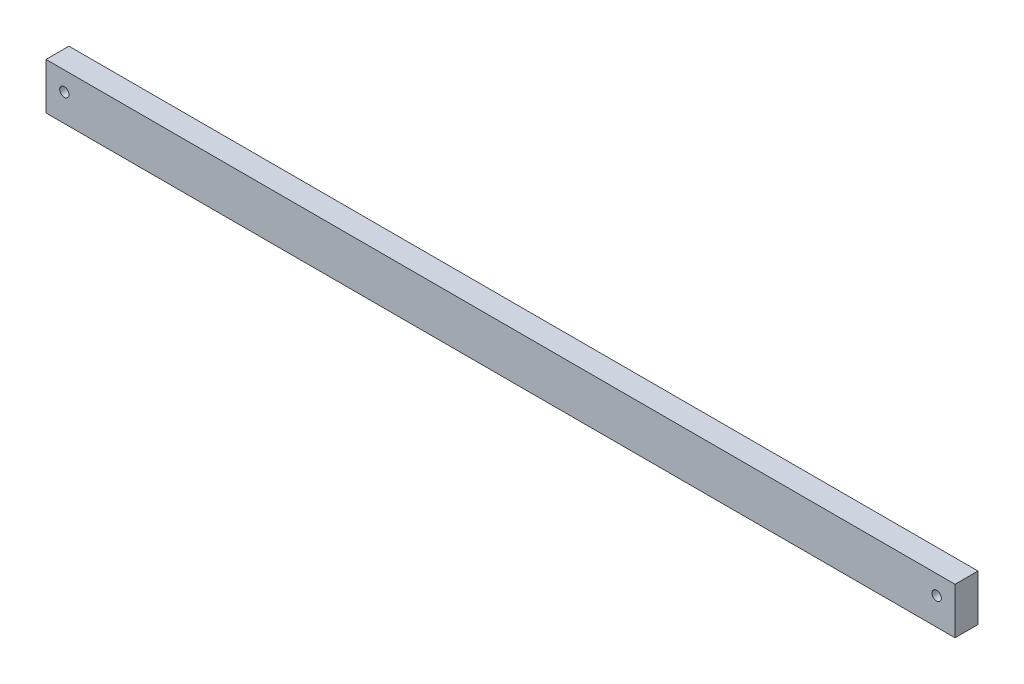
ISO-10303-21;
HEADER;
FILE_DESCRIPTION(('STEP AP214'),'2;1');
FILE_NAME('part.step','',(''),(''),'','','');
FILE_SCHEMA(('AUTOMOTIVE_DESIGN { 1 0 10303 214 1 1 1 1 }'));
ENDSEC;
DATA;
#1=APPLICATION_CONTEXT('core data for automotive mechanical design processes');
#2=APPLICATION_PROTOCOL_DEFINITION('international standard','automotive_design',2000,#1);
#3=PRODUCT_CONTEXT('',#1,'mechanical');
#4=PRODUCT('Part','Part','',(#3));
#5=PRODUCT_RELATED_PRODUCT_CATEGORY('part','',(#4));
#6=PRODUCT_DEFINITION_FORMATION('','',#4);
#7=PRODUCT_DEFINITION_CONTEXT('part definition',#1,'design');
#8=PRODUCT_DEFINITION('design','',#6,#7);
#9=PRODUCT_DEFINITION_SHAPE('','',#8);
#10=(LENGTH_UNIT() NAMED_UNIT(*) SI_UNIT(.MILLI.,.METRE.));
#11=(NAMED_UNIT(*) PLANE_ANGLE_UNIT() SI_UNIT($,.RADIAN.));
#12=(NAMED_UNIT(*) SI_UNIT($,.STERADIAN.) SOLID_ANGLE_UNIT());
#13=UNCERTAINTY_MEASURE_WITH_UNIT(LENGTH_MEASURE(1.E-05),#10,'distance_accuracy_value','');
#14=(GEOMETRIC_REPRESENTATION_CONTEXT(3) GLOBAL_UNCERTAINTY_ASSIGNED_CONTEXT((#13)) GLOBAL_UNIT_ASSIGNED_CONTEXT((#10,
#11,#12)) REPRESENTATION_CONTEXT('',''));
#15=CARTESIAN_POINT('',(0.,0.,0.));
#16=DIRECTION('',(0.,0.,1.));
#17=DIRECTION('',(1.,0.,0.));
#18=AXIS2_PLACEMENT_3D('',#15,#16,#17);
#19=CARTESIAN_POINT('',(-990.,101.05,-50.));
#20=DIRECTION('',(1.,0.,0.));
#21=DIRECTION('',(0.,0.,-1.));
#22=AXIS2_PLACEMENT_3D('',#19,#20,#21);
#23=PLANE('',#22);
#24=DIRECTION('',(0.,0.,1.));
#25=VECTOR('',#24,1.);
#26=CARTESIAN_POINT('',(-990.,0.,-50.));
#27=LINE('',#26,#25);
#28=CARTESIAN_POINT('',(-990.,0.,-50.));
#29=VERTEX_POINT('',#28);
#30=CARTESIAN_POINT('',(-990.,0.,0.));
#31=VERTEX_POINT('',#30);
#32=EDGE_CURVE('E107',#29,#31,#27,.T.);
#33=ORIENTED_EDGE('',*,*,#32,.T.);
#34=DIRECTION('',(0.,-1.,0.));
#35=VECTOR('',#34,1.);
#36=CARTESIAN_POINT('',(-990.,101.05,0.));
#37=LINE('',#36,#35);
#38=CARTESIAN_POINT('',(-990.,101.05,0.));
#39=VERTEX_POINT('',#38);
#40=EDGE_CURVE('E11',#39,#31,#37,.T.);
#41=ORIENTED_EDGE('',*,*,#40,.F.);
#42=DIRECTION('',(0.,0.,1.));
#43=VECTOR('',#42,1.);
#44=CARTESIAN_POINT('',(-990.,101.05,-50.));
#45=LINE('',#44,#43);
#46=CARTESIAN_POINT('',(-990.,101.05,-50.));
#47=VERTEX_POINT('',#46);
#48=EDGE_CURVE('E91',#47,#39,#45,.T.);
#49=ORIENTED_EDGE('',*,*,#48,.F.);
#50=DIRECTION('',(0.,-1.,0.));
#51=VECTOR('',#50,1.);
#52=CARTESIAN_POINT('',(-990.,101.05,-50.));
#53=LINE('',#52,#51);
#54=EDGE_CURVE('E103',#47,#29,#53,.T.);
#55=ORIENTED_EDGE('',*,*,#54,.T.);
#56=EDGE_LOOP('',(#33,#41,#49,#55));
#57=FACE_BOUND('',#56,.T.);
#58=ADVANCED_FACE('F39',(#57),#23,.F.);
#59=CARTESIAN_POINT('',(-990.,101.05,0.));
#60=DIRECTION('',(0.,0.,-1.));
#61=DIRECTION('',(-1.,0.,0.));
#62=AXIS2_PLACEMENT_3D('',#59,#60,#61);
#63=PLANE('',#62);
#64=CARTESIAN_POINT('',(-950.,59.525,0.));
#65=DIRECTION('',(0.,0.,-1.));
#66=DIRECTION('',(-1.,0.,0.));
#67=AXIS2_PLACEMENT_3D('',#64,#65,#66);
#68=CIRCLE('',#67,10.1599999999999);
#69=CARTESIAN_POINT('',(-960.16,59.525,0.));
#70=VERTEX_POINT('',#69);
#71=EDGE_CURVE('E136',#70,#70,#68,.T.);
#72=ORIENTED_EDGE('',*,*,#71,.T.);
#73=EDGE_LOOP('',(#72));
#74=FACE_BOUND('',#73,.T.);
#75=CARTESIAN_POINT('',(950.,59.525,0.));
#76=DIRECTION('',(0.,0.,-1.));
#77=DIRECTION('',(-1.,0.,0.));
#78=AXIS2_PLACEMENT_3D('',#75,#76,#77);
#79=CIRCLE('',#78,10.1599999999999);
#80=CARTESIAN_POINT('',(939.84,59.525,0.));
#81=VERTEX_POINT('',#80);
#82=EDGE_CURVE('E128',#81,#81,#79,.T.);
#83=ORIENTED_EDGE('',*,*,#82,.T.);
#84=EDGE_LOOP('',(#83));
#85=FACE_BOUND('',#84,.T.);
#86=DIRECTION('',(1.,0.,0.));
#87=VECTOR('',#86,1.);
#88=CARTESIAN_POINT('',(-990.,0.,0.));
#89=LINE('',#88,#87);
#90=CARTESIAN_POINT('',(990.,0.,0.));
#91=VERTEX_POINT('',#90);
#92=EDGE_CURVE('E96',#31,#91,#89,.T.);
#93=ORIENTED_EDGE('',*,*,#92,.T.);
#94=DIRECTION('',(0.,-1.,0.));
#95=VECTOR('',#94,1.);
#96=CARTESIAN_POINT('',(990.,101.05,0.));
#97=LINE('',#96,#95);
#98=CARTESIAN_POINT('',(990.,101.05,0.));
#99=VERTEX_POINT('',#98);
#100=EDGE_CURVE('E48',#99,#91,#97,.T.);
#101=ORIENTED_EDGE('',*,*,#100,.F.);
#102=DIRECTION('',(1.,0.,0.));
#103=VECTOR('',#102,1.);
#104=CARTESIAN_POINT('',(-990.,101.05,0.));
#105=LINE('',#104,#103);
#106=EDGE_CURVE('E86',#39,#99,#105,.T.);
#107=ORIENTED_EDGE('',*,*,#106,.F.);
#108=ORIENTED_EDGE('',*,*,#40,.T.);
#109=EDGE_LOOP('',(#93,#101,#107,#108));
#110=FACE_BOUND('',#109,.T.);
#111=ADVANCED_FACE('F95',(#74,#85,#110),#63,.F.);
#112=CARTESIAN_POINT('',(990.,101.05,-50.));
#113=DIRECTION('',(-1.,0.,0.));
#114=DIRECTION('',(0.,0.,1.));
#115=AXIS2_PLACEMENT_3D('',#112,#113,#114);
#116=PLANE('',#115);
#117=DIRECTION('',(0.,0.,-1.));
#118=VECTOR('',#117,1.);
#119=CARTESIAN_POINT('',(990.,0.,-50.));
#120=LINE('',#119,#118);
#121=CARTESIAN_POINT('',(990.,0.,-50.));
#122=VERTEX_POINT('',#121);
#123=EDGE_CURVE('E73',#91,#122,#120,.T.);
#124=ORIENTED_EDGE('',*,*,#123,.T.);
#125=DIRECTION('',(0.,-1.,0.));
#126=VECTOR('',#125,1.);
#127=CARTESIAN_POINT('',(990.,101.05,-50.));
#128=LINE('',#127,#126);
#129=CARTESIAN_POINT('',(990.,101.05,-50.));
#130=VERTEX_POINT('',#129);
#131=EDGE_CURVE('E98',#130,#122,#128,.T.);
#132=ORIENTED_EDGE('',*,*,#131,.F.);
#133=DIRECTION('',(0.,0.,-1.));
#134=VECTOR('',#133,1.);
#135=CARTESIAN_POINT('',(990.,101.05,-50.));
#136=LINE('',#135,#134);
#137=EDGE_CURVE('E89',#99,#130,#136,.T.);
#138=ORIENTED_EDGE('',*,*,#137,.F.);
#139=ORIENTED_EDGE('',*,*,#100,.T.);
#140=EDGE_LOOP('',(#124,#132,#138,#139));
#141=FACE_BOUND('',#140,.T.);
#142=ADVANCED_FACE('F99',(#141),#116,.F.);
#143=CARTESIAN_POINT('',(-990.,101.05,-50.));
#144=DIRECTION('',(0.,0.,1.));
#145=DIRECTION('',(1.,0.,0.));
#146=AXIS2_PLACEMENT_3D('',#143,#144,#145);
#147=PLANE('',#146);
#148=CARTESIAN_POINT('',(-950.,59.525,-50.));
#149=DIRECTION('',(0.,0.,-1.));
#150=DIRECTION('',(-1.,0.,0.));
#151=AXIS2_PLACEMENT_3D('',#148,#149,#150);
#152=CIRCLE('',#151,10.1599999999999);
#153=CARTESIAN_POINT('',(-960.16,59.525,-50.));
#154=VERTEX_POINT('',#153);
#155=EDGE_CURVE('E111',#154,#154,#152,.T.);
#156=ORIENTED_EDGE('',*,*,#155,.F.);
#157=EDGE_LOOP('',(#156));
#158=FACE_BOUND('',#157,.T.);
#159=CARTESIAN_POINT('',(950.,59.525,-50.));
#160=DIRECTION('',(0.,0.,-1.));
#161=DIRECTION('',(-1.,0.,0.));
#162=AXIS2_PLACEMENT_3D('',#159,#160,#161);
#163=CIRCLE('',#162,10.1599999999999);
#164=CARTESIAN_POINT('',(939.84,59.525,-50.));
#165=VERTEX_POINT('',#164);
#166=EDGE_CURVE('E132',#165,#165,#163,.T.);
#167=ORIENTED_EDGE('',*,*,#166,.F.);
#168=EDGE_LOOP('',(#167));
#169=FACE_BOUND('',#168,.T.);
#170=DIRECTION('',(-1.,0.,0.));
#171=VECTOR('',#170,1.);
#172=CARTESIAN_POINT('',(-990.,0.,-50.));
#173=LINE('',#172,#171);
#174=EDGE_CURVE('E79',#122,#29,#173,.T.);
#175=ORIENTED_EDGE('',*,*,#174,.T.);
#176=ORIENTED_EDGE('',*,*,#54,.F.);
#177=DIRECTION('',(-1.,0.,0.));
#178=VECTOR('',#177,1.);
#179=CARTESIAN_POINT('',(-990.,101.05,-50.));
#180=LINE('',#179,#178);
#181=EDGE_CURVE('E56',#130,#47,#180,.T.);
#182=ORIENTED_EDGE('',*,*,#181,.F.);
#183=ORIENTED_EDGE('',*,*,#131,.T.);
#184=EDGE_LOOP('',(#175,#176,#182,#183));
#185=FACE_BOUND('',#184,.T.);
#186=ADVANCED_FACE('F121',(#158,#169,#185),#147,.F.);
#187=CARTESIAN_POINT('',(0.,101.05,0.));
#188=DIRECTION('',(0.,1.,0.));
#189=DIRECTION('',(0.,0.,1.));
#190=AXIS2_PLACEMENT_3D('',#187,#188,#189);
#191=PLANE('',#190);
#192=ORIENTED_EDGE('',*,*,#48,.T.);
#193=ORIENTED_EDGE('',*,*,#106,.T.);
#194=ORIENTED_EDGE('',*,*,#137,.T.);
#195=ORIENTED_EDGE('',*,*,#181,.T.);
#196=EDGE_LOOP('',(#192,#193,#194,#195));
#197=FACE_BOUND('',#196,.T.);
#198=ADVANCED_FACE('F87',(#197),#191,.T.);
#199=CARTESIAN_POINT('',(0.,0.,0.));
#200=DIRECTION('',(0.,1.,0.));
#201=DIRECTION('',(0.,0.,1.));
#202=AXIS2_PLACEMENT_3D('',#199,#200,#201);
#203=PLANE('',#202);
#204=ORIENTED_EDGE('',*,*,#32,.F.);
#205=ORIENTED_EDGE('',*,*,#174,.F.);
#206=ORIENTED_EDGE('',*,*,#123,.F.);
#207=ORIENTED_EDGE('',*,*,#92,.F.);
#208=EDGE_LOOP('',(#204,#205,#206,#207));
#209=FACE_BOUND('',#208,.T.);
#210=ADVANCED_FACE('F124',(#209),#203,.F.);
#211=CARTESIAN_POINT('',(950.,59.525,-50.));
#212=DIRECTION('',(0.,0.,1.));
#213=DIRECTION('',(1.,0.,0.));
#214=AXIS2_PLACEMENT_3D('',#211,#212,#213);
#215=CYLINDRICAL_SURFACE('',#214,10.1599999999999);
#216=ORIENTED_EDGE('',*,*,#166,.T.);
#217=EDGE_LOOP('',(#216));
#218=FACE_BOUND('',#217,.T.);
#219=ORIENTED_EDGE('',*,*,#82,.F.);
#220=EDGE_LOOP('',(#219));
#221=FACE_BOUND('',#220,.T.);
#222=ADVANCED_FACE('F152',(#218,#221),#215,.F.);
#223=CARTESIAN_POINT('',(-950.,59.525,-50.));
#224=DIRECTION('',(0.,0.,1.));
#225=DIRECTION('',(1.,0.,0.));
#226=AXIS2_PLACEMENT_3D('',#223,#224,#225);
#227=CYLINDRICAL_SURFACE('',#226,10.1599999999999);
#228=ORIENTED_EDGE('',*,*,#155,.T.);
#229=EDGE_LOOP('',(#228));
#230=FACE_BOUND('',#229,.T.);
#231=ORIENTED_EDGE('',*,*,#71,.F.);
#232=EDGE_LOOP('',(#231));
#233=FACE_BOUND('',#232,.T.);
#234=ADVANCED_FACE('F144',(#230,#233),#227,.F.);
#235=CLOSED_SHELL('',(#58,#111,#142,#186,#198,#210,#222,#234));
#236=MANIFOLD_SOLID_BREP('B2',#235);
#237=ADVANCED_BREP_SHAPE_REPRESENTATION('',(#18,#236),#14);
#238=SHAPE_DEFINITION_REPRESENTATION(#9,#237);
ENDSEC;
END-ISO-10303-21;
